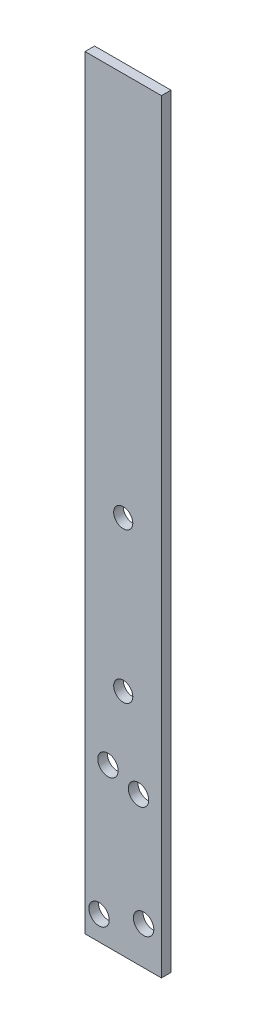
ISO-10303-21;
HEADER;
FILE_DESCRIPTION(('STEP AP214'),'2;1');
FILE_NAME('part.step','',(''),(''),'','','');
FILE_SCHEMA(('AUTOMOTIVE_DESIGN { 1 0 10303 214 1 1 1 1 }'));
ENDSEC;
DATA;
#1=APPLICATION_CONTEXT('core data for automotive mechanical design processes');
#2=APPLICATION_PROTOCOL_DEFINITION('international standard','automotive_design',2000,#1);
#3=PRODUCT_CONTEXT('',#1,'mechanical');
#4=PRODUCT('Part','Part','',(#3));
#5=PRODUCT_RELATED_PRODUCT_CATEGORY('part','',(#4));
#6=PRODUCT_DEFINITION_FORMATION('','',#4);
#7=PRODUCT_DEFINITION_CONTEXT('part definition',#1,'design');
#8=PRODUCT_DEFINITION('design','',#6,#7);
#9=PRODUCT_DEFINITION_SHAPE('','',#8);
#10=(LENGTH_UNIT() NAMED_UNIT(*) SI_UNIT(.MILLI.,.METRE.));
#11=(NAMED_UNIT(*) PLANE_ANGLE_UNIT() SI_UNIT($,.RADIAN.));
#12=(NAMED_UNIT(*) SI_UNIT($,.STERADIAN.) SOLID_ANGLE_UNIT());
#13=UNCERTAINTY_MEASURE_WITH_UNIT(LENGTH_MEASURE(1.E-05),#10,'distance_accuracy_value','');
#14=(GEOMETRIC_REPRESENTATION_CONTEXT(3) GLOBAL_UNCERTAINTY_ASSIGNED_CONTEXT((#13)) GLOBAL_UNIT_ASSIGNED_CONTEXT((#10,
#11,#12)) REPRESENTATION_CONTEXT('',''));
#15=CARTESIAN_POINT('',(0.,0.,0.));
#16=DIRECTION('',(0.,0.,1.));
#17=DIRECTION('',(1.,0.,0.));
#18=AXIS2_PLACEMENT_3D('',#15,#16,#17);
#19=CARTESIAN_POINT('',(0.,0.,4.7625));
#20=DIRECTION('',(0.,0.,1.));
#21=DIRECTION('',(1.,0.,0.));
#22=AXIS2_PLACEMENT_3D('',#19,#20,#21);
#23=PLANE('',#22);
#24=CARTESIAN_POINT('',(6.98500000000002,12.01546619,4.7625));
#25=DIRECTION('',(0.,0.,1.));
#26=DIRECTION('',(1.,0.,0.));
#27=AXIS2_PLACEMENT_3D('',#24,#25,#26);
#28=CIRCLE('',#27,5.08000000000001);
#29=CARTESIAN_POINT('',(1.90500000000002,12.01546619,4.7625));
#30=VERTEX_POINT('',#29);
#31=EDGE_CURVE('E162',#30,#30,#28,.T.);
#32=ORIENTED_EDGE('',*,*,#31,.F.);
#33=EDGE_LOOP('',(#32));
#34=FACE_BOUND('',#33,.T.);
#35=CARTESIAN_POINT('',(11.43,78.69046619,4.7625));
#36=DIRECTION('',(0.,0.,1.));
#37=DIRECTION('',(1.,0.,0.));
#38=AXIS2_PLACEMENT_3D('',#35,#36,#37);
#39=CIRCLE('',#38,5.08);
#40=CARTESIAN_POINT('',(6.35000000000001,78.69046619,4.7625));
#41=VERTEX_POINT('',#40);
#42=EDGE_CURVE('E146',#41,#41,#39,.T.);
#43=ORIENTED_EDGE('',*,*,#42,.F.);
#44=EDGE_LOOP('',(#43));
#45=FACE_BOUND('',#44,.T.);
#46=CARTESIAN_POINT('',(19.05,114.3,4.7625));
#47=DIRECTION('',(0.,0.,1.));
#48=DIRECTION('',(1.,0.,0.));
#49=AXIS2_PLACEMENT_3D('',#46,#47,#48);
#50=CIRCLE('',#49,4.7625);
#51=CARTESIAN_POINT('',(14.2875,114.3,4.7625));
#52=VERTEX_POINT('',#51);
#53=EDGE_CURVE('E116',#52,#52,#50,.T.);
#54=ORIENTED_EDGE('',*,*,#53,.F.);
#55=EDGE_LOOP('',(#54));
#56=FACE_BOUND('',#55,.T.);
#57=DIRECTION('',(1.,0.,0.));
#58=VECTOR('',#57,1.);
#59=CARTESIAN_POINT('',(0.,0.,4.7625));
#60=LINE('',#59,#58);
#61=CARTESIAN_POINT('',(0.,0.,4.7625));
#62=VERTEX_POINT('',#61);
#63=CARTESIAN_POINT('',(38.1,0.,4.7625));
#64=VERTEX_POINT('',#63);
#65=EDGE_CURVE('E96',#62,#64,#60,.T.);
#66=ORIENTED_EDGE('',*,*,#65,.T.);
#67=DIRECTION('',(0.,1.,0.));
#68=VECTOR('',#67,1.);
#69=CARTESIAN_POINT('',(38.1,0.,4.7625));
#70=LINE('',#69,#68);
#71=CARTESIAN_POINT('',(38.0999999999999,381.,4.7625));
#72=VERTEX_POINT('',#71);
#73=EDGE_CURVE('E91',#64,#72,#70,.T.);
#74=ORIENTED_EDGE('',*,*,#73,.T.);
#75=DIRECTION('',(-1.,0.,0.));
#76=VECTOR('',#75,1.);
#77=CARTESIAN_POINT('',(38.0999999999999,381.,4.7625));
#78=LINE('',#77,#76);
#79=CARTESIAN_POINT('',(0.,381.,4.7625));
#80=VERTEX_POINT('',#79);
#81=EDGE_CURVE('E94',#72,#80,#78,.T.);
#82=ORIENTED_EDGE('',*,*,#81,.T.);
#83=DIRECTION('',(0.,-1.,0.));
#84=VECTOR('',#83,1.);
#85=CARTESIAN_POINT('',(0.,0.,4.7625));
#86=LINE('',#85,#84);
#87=EDGE_CURVE('E61',#80,#62,#86,.T.);
#88=ORIENTED_EDGE('',*,*,#87,.T.);
#89=EDGE_LOOP('',(#66,#74,#82,#88));
#90=FACE_BOUND('',#89,.T.);
#91=CARTESIAN_POINT('',(19.05,189.23,4.7625));
#92=DIRECTION('',(0.,0.,1.));
#93=DIRECTION('',(1.,0.,0.));
#94=AXIS2_PLACEMENT_3D('',#91,#92,#93);
#95=CIRCLE('',#94,4.7625);
#96=CARTESIAN_POINT('',(14.2875,189.23,4.7625));
#97=VERTEX_POINT('',#96);
#98=EDGE_CURVE('E138',#97,#97,#95,.T.);
#99=ORIENTED_EDGE('',*,*,#98,.F.);
#100=EDGE_LOOP('',(#99));
#101=FACE_BOUND('',#100,.T.);
#102=CARTESIAN_POINT('',(26.67,73.61046619,4.7625));
#103=DIRECTION('',(0.,0.,1.));
#104=DIRECTION('',(1.,0.,0.));
#105=AXIS2_PLACEMENT_3D('',#102,#103,#104);
#106=CIRCLE('',#105,5.08000000000001);
#107=CARTESIAN_POINT('',(21.59,73.61046619,4.7625));
#108=VERTEX_POINT('',#107);
#109=EDGE_CURVE('E154',#108,#108,#106,.T.);
#110=ORIENTED_EDGE('',*,*,#109,.F.);
#111=EDGE_LOOP('',(#110));
#112=FACE_BOUND('',#111,.T.);
#113=CARTESIAN_POINT('',(29.21,19.00046619,4.7625));
#114=DIRECTION('',(0.,0.,1.));
#115=DIRECTION('',(1.,0.,0.));
#116=AXIS2_PLACEMENT_3D('',#113,#114,#115);
#117=CIRCLE('',#116,5.08);
#118=CARTESIAN_POINT('',(24.13,19.00046619,4.7625));
#119=VERTEX_POINT('',#118);
#120=EDGE_CURVE('E170',#119,#119,#117,.T.);
#121=ORIENTED_EDGE('',*,*,#120,.F.);
#122=EDGE_LOOP('',(#121));
#123=FACE_BOUND('',#122,.T.);
#124=ADVANCED_FACE('F43',(#34,#45,#56,#90,#101,#112,#123),#23,.T.);
#125=CARTESIAN_POINT('',(0.,0.,0.));
#126=DIRECTION('',(0.,0.,1.));
#127=DIRECTION('',(1.,0.,0.));
#128=AXIS2_PLACEMENT_3D('',#125,#126,#127);
#129=PLANE('',#128);
#130=DIRECTION('',(1.,0.,0.));
#131=VECTOR('',#130,1.);
#132=CARTESIAN_POINT('',(0.,0.,0.));
#133=LINE('',#132,#131);
#134=CARTESIAN_POINT('',(0.,0.,0.));
#135=VERTEX_POINT('',#134);
#136=CARTESIAN_POINT('',(38.1,0.,0.));
#137=VERTEX_POINT('',#136);
#138=EDGE_CURVE('E112',#135,#137,#133,.T.);
#139=ORIENTED_EDGE('',*,*,#138,.F.);
#140=DIRECTION('',(0.,-1.,0.));
#141=VECTOR('',#140,1.);
#142=CARTESIAN_POINT('',(0.,0.,0.));
#143=LINE('',#142,#141);
#144=CARTESIAN_POINT('',(0.,381.,0.));
#145=VERTEX_POINT('',#144);
#146=EDGE_CURVE('E84',#145,#135,#143,.T.);
#147=ORIENTED_EDGE('',*,*,#146,.F.);
#148=DIRECTION('',(-1.,0.,0.));
#149=VECTOR('',#148,1.);
#150=CARTESIAN_POINT('',(38.0999999999999,381.,0.));
#151=LINE('',#150,#149);
#152=CARTESIAN_POINT('',(38.0999999999999,381.,0.));
#153=VERTEX_POINT('',#152);
#154=EDGE_CURVE('E78',#153,#145,#151,.T.);
#155=ORIENTED_EDGE('',*,*,#154,.F.);
#156=DIRECTION('',(0.,1.,0.));
#157=VECTOR('',#156,1.);
#158=CARTESIAN_POINT('',(38.1,0.,0.));
#159=LINE('',#158,#157);
#160=EDGE_CURVE('E101',#137,#153,#159,.T.);
#161=ORIENTED_EDGE('',*,*,#160,.F.);
#162=EDGE_LOOP('',(#139,#147,#155,#161));
#163=FACE_BOUND('',#162,.T.);
#164=CARTESIAN_POINT('',(19.05,114.3,0.));
#165=DIRECTION('',(0.,0.,1.));
#166=DIRECTION('',(1.,0.,0.));
#167=AXIS2_PLACEMENT_3D('',#164,#165,#166);
#168=CIRCLE('',#167,4.7625);
#169=CARTESIAN_POINT('',(14.2875,114.3,0.));
#170=VERTEX_POINT('',#169);
#171=EDGE_CURVE('E134',#170,#170,#168,.T.);
#172=ORIENTED_EDGE('',*,*,#171,.T.);
#173=EDGE_LOOP('',(#172));
#174=FACE_BOUND('',#173,.T.);
#175=CARTESIAN_POINT('',(19.05,189.23,0.));
#176=DIRECTION('',(0.,0.,1.));
#177=DIRECTION('',(1.,0.,0.));
#178=AXIS2_PLACEMENT_3D('',#175,#176,#177);
#179=CIRCLE('',#178,4.7625);
#180=CARTESIAN_POINT('',(14.2875,189.23,0.));
#181=VERTEX_POINT('',#180);
#182=EDGE_CURVE('E142',#181,#181,#179,.T.);
#183=ORIENTED_EDGE('',*,*,#182,.T.);
#184=EDGE_LOOP('',(#183));
#185=FACE_BOUND('',#184,.T.);
#186=CARTESIAN_POINT('',(11.43,78.69046619,0.));
#187=DIRECTION('',(0.,0.,1.));
#188=DIRECTION('',(1.,0.,0.));
#189=AXIS2_PLACEMENT_3D('',#186,#187,#188);
#190=CIRCLE('',#189,5.08);
#191=CARTESIAN_POINT('',(6.35000000000001,78.69046619,0.));
#192=VERTEX_POINT('',#191);
#193=EDGE_CURVE('E150',#192,#192,#190,.T.);
#194=ORIENTED_EDGE('',*,*,#193,.T.);
#195=EDGE_LOOP('',(#194));
#196=FACE_BOUND('',#195,.T.);
#197=CARTESIAN_POINT('',(26.67,73.61046619,0.));
#198=DIRECTION('',(0.,0.,1.));
#199=DIRECTION('',(1.,0.,0.));
#200=AXIS2_PLACEMENT_3D('',#197,#198,#199);
#201=CIRCLE('',#200,5.08000000000001);
#202=CARTESIAN_POINT('',(21.59,73.61046619,0.));
#203=VERTEX_POINT('',#202);
#204=EDGE_CURVE('E158',#203,#203,#201,.T.);
#205=ORIENTED_EDGE('',*,*,#204,.T.);
#206=EDGE_LOOP('',(#205));
#207=FACE_BOUND('',#206,.T.);
#208=CARTESIAN_POINT('',(6.98500000000002,12.01546619,0.));
#209=DIRECTION('',(0.,0.,1.));
#210=DIRECTION('',(1.,0.,0.));
#211=AXIS2_PLACEMENT_3D('',#208,#209,#210);
#212=CIRCLE('',#211,5.08000000000001);
#213=CARTESIAN_POINT('',(1.90500000000002,12.01546619,0.));
#214=VERTEX_POINT('',#213);
#215=EDGE_CURVE('E166',#214,#214,#212,.T.);
#216=ORIENTED_EDGE('',*,*,#215,.T.);
#217=EDGE_LOOP('',(#216));
#218=FACE_BOUND('',#217,.T.);
#219=CARTESIAN_POINT('',(29.21,19.00046619,0.));
#220=DIRECTION('',(0.,0.,1.));
#221=DIRECTION('',(1.,0.,0.));
#222=AXIS2_PLACEMENT_3D('',#219,#220,#221);
#223=CIRCLE('',#222,5.08);
#224=CARTESIAN_POINT('',(24.13,19.00046619,0.));
#225=VERTEX_POINT('',#224);
#226=EDGE_CURVE('E174',#225,#225,#223,.T.);
#227=ORIENTED_EDGE('',*,*,#226,.T.);
#228=EDGE_LOOP('',(#227));
#229=FACE_BOUND('',#228,.T.);
#230=ADVANCED_FACE('F129',(#163,#174,#185,#196,#207,#218,#229),#129,.F.);
#231=CARTESIAN_POINT('',(0.,0.,4.7625));
#232=DIRECTION('',(0.,1.,0.));
#233=DIRECTION('',(0.,0.,1.));
#234=AXIS2_PLACEMENT_3D('',#231,#232,#233);
#235=PLANE('',#234);
#236=ORIENTED_EDGE('',*,*,#138,.T.);
#237=DIRECTION('',(0.,0.,-1.));
#238=VECTOR('',#237,1.);
#239=CARTESIAN_POINT('',(38.1,0.,4.7625));
#240=LINE('',#239,#238);
#241=EDGE_CURVE('E11',#64,#137,#240,.T.);
#242=ORIENTED_EDGE('',*,*,#241,.F.);
#243=ORIENTED_EDGE('',*,*,#65,.F.);
#244=DIRECTION('',(0.,0.,-1.));
#245=VECTOR('',#244,1.);
#246=CARTESIAN_POINT('',(0.,0.,4.7625));
#247=LINE('',#246,#245);
#248=EDGE_CURVE('E108',#62,#135,#247,.T.);
#249=ORIENTED_EDGE('',*,*,#248,.T.);
#250=EDGE_LOOP('',(#236,#242,#243,#249));
#251=FACE_BOUND('',#250,.T.);
#252=ADVANCED_FACE('F45',(#251),#235,.F.);
#253=CARTESIAN_POINT('',(38.1,0.,4.7625));
#254=DIRECTION('',(-1.,0.,0.));
#255=DIRECTION('',(0.,-1.,0.));
#256=AXIS2_PLACEMENT_3D('',#253,#254,#255);
#257=PLANE('',#256);
#258=ORIENTED_EDGE('',*,*,#160,.T.);
#259=DIRECTION('',(0.,0.,-1.));
#260=VECTOR('',#259,1.);
#261=CARTESIAN_POINT('',(38.0999999999999,381.,4.7625));
#262=LINE('',#261,#260);
#263=EDGE_CURVE('E53',#72,#153,#262,.T.);
#264=ORIENTED_EDGE('',*,*,#263,.F.);
#265=ORIENTED_EDGE('',*,*,#73,.F.);
#266=ORIENTED_EDGE('',*,*,#241,.T.);
#267=EDGE_LOOP('',(#258,#264,#265,#266));
#268=FACE_BOUND('',#267,.T.);
#269=ADVANCED_FACE('F100',(#268),#257,.F.);
#270=CARTESIAN_POINT('',(38.0999999999999,381.,4.7625));
#271=DIRECTION('',(0.,-1.,0.));
#272=DIRECTION('',(0.,0.,-1.));
#273=AXIS2_PLACEMENT_3D('',#270,#271,#272);
#274=PLANE('',#273);
#275=ORIENTED_EDGE('',*,*,#154,.T.);
#276=DIRECTION('',(0.,0.,-1.));
#277=VECTOR('',#276,1.);
#278=CARTESIAN_POINT('',(0.,381.,4.7625));
#279=LINE('',#278,#277);
#280=EDGE_CURVE('E103',#80,#145,#279,.T.);
#281=ORIENTED_EDGE('',*,*,#280,.F.);
#282=ORIENTED_EDGE('',*,*,#81,.F.);
#283=ORIENTED_EDGE('',*,*,#263,.T.);
#284=EDGE_LOOP('',(#275,#281,#282,#283));
#285=FACE_BOUND('',#284,.T.);
#286=ADVANCED_FACE('F104',(#285),#274,.F.);
#287=CARTESIAN_POINT('',(0.,0.,4.7625));
#288=DIRECTION('',(1.,0.,0.));
#289=DIRECTION('',(0.,1.,0.));
#290=AXIS2_PLACEMENT_3D('',#287,#288,#289);
#291=PLANE('',#290);
#292=ORIENTED_EDGE('',*,*,#146,.T.);
#293=ORIENTED_EDGE('',*,*,#248,.F.);
#294=ORIENTED_EDGE('',*,*,#87,.F.);
#295=ORIENTED_EDGE('',*,*,#280,.T.);
#296=EDGE_LOOP('',(#292,#293,#294,#295));
#297=FACE_BOUND('',#296,.T.);
#298=ADVANCED_FACE('F126',(#297),#291,.F.);
#299=CARTESIAN_POINT('',(19.05,114.3,4.7625));
#300=DIRECTION('',(0.,0.,-1.));
#301=DIRECTION('',(-1.,0.,0.));
#302=AXIS2_PLACEMENT_3D('',#299,#300,#301);
#303=CYLINDRICAL_SURFACE('',#302,4.7625);
#304=CARTESIAN_POINT('',(14.2875,114.3,4.7625));
#305=CARTESIAN_POINT('',(14.2875,114.3,4.712890625));
#306=CARTESIAN_POINT('',(14.2875,114.3,4.66328125));
#307=CARTESIAN_POINT('',(14.2875,114.3,4.5640625));
#308=CARTESIAN_POINT('',(14.2875,114.3,4.514453125));
#309=CARTESIAN_POINT('',(14.2875,114.3,4.415234375));
#310=CARTESIAN_POINT('',(14.2875,114.3,4.365625));
#311=CARTESIAN_POINT('',(14.2875,114.3,4.26640625));
#312=CARTESIAN_POINT('',(14.2875,114.3,4.216796875));
#313=CARTESIAN_POINT('',(14.2875,114.3,4.117578125));
#314=CARTESIAN_POINT('',(14.2875,114.3,4.06796875));
#315=CARTESIAN_POINT('',(14.2875,114.3,3.96875));
#316=CARTESIAN_POINT('',(14.2875,114.3,3.919140625));
#317=CARTESIAN_POINT('',(14.2875,114.3,3.819921875));
#318=CARTESIAN_POINT('',(14.2875,114.3,3.7703125));
#319=CARTESIAN_POINT('',(14.2875,114.3,3.67109375));
#320=CARTESIAN_POINT('',(14.2875,114.3,3.621484375));
#321=CARTESIAN_POINT('',(14.2875,114.3,3.522265625));
#322=CARTESIAN_POINT('',(14.2875,114.3,3.47265625));
#323=CARTESIAN_POINT('',(14.2875,114.3,3.3734375));
#324=CARTESIAN_POINT('',(14.2875,114.3,3.323828125));
#325=CARTESIAN_POINT('',(14.2875,114.3,3.224609375));
#326=CARTESIAN_POINT('',(14.2875,114.3,3.175));
#327=CARTESIAN_POINT('',(14.2875,114.3,3.07578125));
#328=CARTESIAN_POINT('',(14.2875,114.3,3.026171875));
#329=CARTESIAN_POINT('',(14.2875,114.3,2.926953125));
#330=CARTESIAN_POINT('',(14.2875,114.3,2.87734375));
#331=CARTESIAN_POINT('',(14.2875,114.3,2.778125));
#332=CARTESIAN_POINT('',(14.2875,114.3,2.728515625));
#333=CARTESIAN_POINT('',(14.2875,114.3,2.629296875));
#334=CARTESIAN_POINT('',(14.2875,114.3,2.5796875));
#335=CARTESIAN_POINT('',(14.2875,114.3,2.48046875));
#336=CARTESIAN_POINT('',(14.2875,114.3,2.430859375));
#337=CARTESIAN_POINT('',(14.2875,114.3,2.331640625));
#338=CARTESIAN_POINT('',(14.2875,114.3,2.28203125));
#339=CARTESIAN_POINT('',(14.2875,114.3,2.1828125));
#340=CARTESIAN_POINT('',(14.2875,114.3,2.133203125));
#341=CARTESIAN_POINT('',(14.2875,114.3,2.033984375));
#342=CARTESIAN_POINT('',(14.2875,114.3,1.984375));
#343=CARTESIAN_POINT('',(14.2875,114.3,1.88515625));
#344=CARTESIAN_POINT('',(14.2875,114.3,1.835546875));
#345=CARTESIAN_POINT('',(14.2875,114.3,1.736328125));
#346=CARTESIAN_POINT('',(14.2875,114.3,1.68671875));
#347=CARTESIAN_POINT('',(14.2875,114.3,1.5875));
#348=CARTESIAN_POINT('',(14.2875,114.3,1.537890625));
#349=CARTESIAN_POINT('',(14.2875,114.3,1.438671875));
#350=CARTESIAN_POINT('',(14.2875,114.3,1.3890625));
#351=CARTESIAN_POINT('',(14.2875,114.3,1.28984375));
#352=CARTESIAN_POINT('',(14.2875,114.3,1.240234375));
#353=CARTESIAN_POINT('',(14.2875,114.3,1.141015625));
#354=CARTESIAN_POINT('',(14.2875,114.3,1.09140625));
#355=CARTESIAN_POINT('',(14.2875,114.3,0.992187499999999));
#356=CARTESIAN_POINT('',(14.2875,114.3,0.942578124999999));
#357=CARTESIAN_POINT('',(14.2875,114.3,0.843359375));
#358=CARTESIAN_POINT('',(14.2875,114.3,0.79375));
#359=CARTESIAN_POINT('',(14.2875,114.3,0.69453125));
#360=CARTESIAN_POINT('',(14.2875,114.3,0.644921875));
#361=CARTESIAN_POINT('',(14.2875,114.3,0.545703125));
#362=CARTESIAN_POINT('',(14.2875,114.3,0.49609375));
#363=CARTESIAN_POINT('',(14.2875,114.3,0.396875));
#364=CARTESIAN_POINT('',(14.2875,114.3,0.347265625));
#365=CARTESIAN_POINT('',(14.2875,114.3,0.248046875));
#366=CARTESIAN_POINT('',(14.2875,114.3,0.1984375));
#367=CARTESIAN_POINT('',(14.2875,114.3,0.09921875));
#368=CARTESIAN_POINT('',(14.2875,114.3,0.049609375));
#369=CARTESIAN_POINT('',(14.2875,114.3,0.));
#370=B_SPLINE_CURVE_WITH_KNOTS('',3,(#304,#305,#306,#307,#308,#309,#310,#311,#312,#313,#314,
#315,#316,#317,#318,#319,#320,#321,#322,#323,#324,#325,#326,#327,#328,#329,#330,#331,#332,#333,
#334,#335,#336,#337,#338,#339,#340,#341,#342,#343,#344,#345,#346,#347,#348,#349,#350,#351,#352,
#353,#354,#355,#356,#357,#358,#359,#360,#361,#362,#363,#364,#365,#366,#367,#368,#369),
.UNSPECIFIED.,.F.,.F.,(4,2,2,2,2,2,2,2,2,2,2,2,2,2,2,2,2,2,2,2,2,2,2,2,2,2,2,2,2,2,2,2,4),(0.,
0.148828125,0.29765625,0.446484375,0.5953125,0.744140625,0.892968750000001,1.041796875,1.190625,
1.339453125,1.48828125,1.637109375,1.7859375,1.934765625,2.08359375,2.232421875,2.38125,
2.530078125,2.67890625,2.827734375,2.9765625,3.125390625,3.27421875,3.423046875,3.571875,
3.720703125,3.86953125,4.018359375,4.1671875,4.316015625,4.46484375,4.613671875,4.7625),.UNSPECIFIED.);
#371=EDGE_CURVE('BSEAM195',#52,#170,#370,.T.);
#372=ORIENTED_EDGE('',*,*,#53,.T.);
#373=ORIENTED_EDGE('',*,*,#171,.F.);
#374=ORIENTED_EDGE('',*,*,#371,.T.);
#375=ORIENTED_EDGE('',*,*,#371,.F.);
#376=EDGE_LOOP('',(#372,#374,#373,#375));
#377=FACE_BOUND('',#376,.T.);
#378=ADVANCED_FACE('F195',(#377),#303,.F.);
#379=CARTESIAN_POINT('',(19.05,189.23,4.7625));
#380=DIRECTION('',(0.,0.,-1.));
#381=DIRECTION('',(-1.,0.,0.));
#382=AXIS2_PLACEMENT_3D('',#379,#380,#381);
#383=CYLINDRICAL_SURFACE('',#382,4.7625);
#384=CARTESIAN_POINT('',(14.2875,189.23,4.7625));
#385=CARTESIAN_POINT('',(14.2875,189.23,4.712890625));
#386=CARTESIAN_POINT('',(14.2875,189.23,4.66328125));
#387=CARTESIAN_POINT('',(14.2875,189.23,4.5640625));
#388=CARTESIAN_POINT('',(14.2875,189.23,4.514453125));
#389=CARTESIAN_POINT('',(14.2875,189.23,4.415234375));
#390=CARTESIAN_POINT('',(14.2875,189.23,4.365625));
#391=CARTESIAN_POINT('',(14.2875,189.23,4.26640625));
#392=CARTESIAN_POINT('',(14.2875,189.23,4.216796875));
#393=CARTESIAN_POINT('',(14.2875,189.23,4.117578125));
#394=CARTESIAN_POINT('',(14.2875,189.23,4.06796875));
#395=CARTESIAN_POINT('',(14.2875,189.23,3.96875));
#396=CARTESIAN_POINT('',(14.2875,189.23,3.919140625));
#397=CARTESIAN_POINT('',(14.2875,189.23,3.819921875));
#398=CARTESIAN_POINT('',(14.2875,189.23,3.7703125));
#399=CARTESIAN_POINT('',(14.2875,189.23,3.67109375));
#400=CARTESIAN_POINT('',(14.2875,189.23,3.621484375));
#401=CARTESIAN_POINT('',(14.2875,189.23,3.522265625));
#402=CARTESIAN_POINT('',(14.2875,189.23,3.47265625));
#403=CARTESIAN_POINT('',(14.2875,189.23,3.3734375));
#404=CARTESIAN_POINT('',(14.2875,189.23,3.323828125));
#405=CARTESIAN_POINT('',(14.2875,189.23,3.224609375));
#406=CARTESIAN_POINT('',(14.2875,189.23,3.175));
#407=CARTESIAN_POINT('',(14.2875,189.23,3.07578125));
#408=CARTESIAN_POINT('',(14.2875,189.23,3.026171875));
#409=CARTESIAN_POINT('',(14.2875,189.23,2.926953125));
#410=CARTESIAN_POINT('',(14.2875,189.23,2.87734375));
#411=CARTESIAN_POINT('',(14.2875,189.23,2.778125));
#412=CARTESIAN_POINT('',(14.2875,189.23,2.728515625));
#413=CARTESIAN_POINT('',(14.2875,189.23,2.629296875));
#414=CARTESIAN_POINT('',(14.2875,189.23,2.5796875));
#415=CARTESIAN_POINT('',(14.2875,189.23,2.48046875));
#416=CARTESIAN_POINT('',(14.2875,189.23,2.430859375));
#417=CARTESIAN_POINT('',(14.2875,189.23,2.331640625));
#418=CARTESIAN_POINT('',(14.2875,189.23,2.28203125));
#419=CARTESIAN_POINT('',(14.2875,189.23,2.1828125));
#420=CARTESIAN_POINT('',(14.2875,189.23,2.133203125));
#421=CARTESIAN_POINT('',(14.2875,189.23,2.033984375));
#422=CARTESIAN_POINT('',(14.2875,189.23,1.984375));
#423=CARTESIAN_POINT('',(14.2875,189.23,1.88515625));
#424=CARTESIAN_POINT('',(14.2875,189.23,1.835546875));
#425=CARTESIAN_POINT('',(14.2875,189.23,1.736328125));
#426=CARTESIAN_POINT('',(14.2875,189.23,1.68671875));
#427=CARTESIAN_POINT('',(14.2875,189.23,1.5875));
#428=CARTESIAN_POINT('',(14.2875,189.23,1.537890625));
#429=CARTESIAN_POINT('',(14.2875,189.23,1.438671875));
#430=CARTESIAN_POINT('',(14.2875,189.23,1.3890625));
#431=CARTESIAN_POINT('',(14.2875,189.23,1.28984375));
#432=CARTESIAN_POINT('',(14.2875,189.23,1.240234375));
#433=CARTESIAN_POINT('',(14.2875,189.23,1.141015625));
#434=CARTESIAN_POINT('',(14.2875,189.23,1.09140625));
#435=CARTESIAN_POINT('',(14.2875,189.23,0.992187499999999));
#436=CARTESIAN_POINT('',(14.2875,189.23,0.942578124999999));
#437=CARTESIAN_POINT('',(14.2875,189.23,0.843359375));
#438=CARTESIAN_POINT('',(14.2875,189.23,0.79375));
#439=CARTESIAN_POINT('',(14.2875,189.23,0.69453125));
#440=CARTESIAN_POINT('',(14.2875,189.23,0.644921875));
#441=CARTESIAN_POINT('',(14.2875,189.23,0.545703125));
#442=CARTESIAN_POINT('',(14.2875,189.23,0.49609375));
#443=CARTESIAN_POINT('',(14.2875,189.23,0.396875));
#444=CARTESIAN_POINT('',(14.2875,189.23,0.347265625));
#445=CARTESIAN_POINT('',(14.2875,189.23,0.248046875));
#446=CARTESIAN_POINT('',(14.2875,189.23,0.1984375));
#447=CARTESIAN_POINT('',(14.2875,189.23,0.09921875));
#448=CARTESIAN_POINT('',(14.2875,189.23,0.049609375));
#449=CARTESIAN_POINT('',(14.2875,189.23,0.));
#450=B_SPLINE_CURVE_WITH_KNOTS('',3,(#384,#385,#386,#387,#388,#389,#390,#391,#392,#393,#394,
#395,#396,#397,#398,#399,#400,#401,#402,#403,#404,#405,#406,#407,#408,#409,#410,#411,#412,#413,
#414,#415,#416,#417,#418,#419,#420,#421,#422,#423,#424,#425,#426,#427,#428,#429,#430,#431,#432,
#433,#434,#435,#436,#437,#438,#439,#440,#441,#442,#443,#444,#445,#446,#447,#448,#449),
.UNSPECIFIED.,.F.,.F.,(4,2,2,2,2,2,2,2,2,2,2,2,2,2,2,2,2,2,2,2,2,2,2,2,2,2,2,2,2,2,2,2,4),(0.,
0.148828125,0.29765625,0.446484375,0.5953125,0.744140625,0.892968750000001,1.041796875,1.190625,
1.339453125,1.48828125,1.637109375,1.7859375,1.934765625,2.08359375,2.232421875,2.38125,
2.530078125,2.67890625,2.827734375,2.9765625,3.125390625,3.27421875,3.423046875,3.571875,
3.720703125,3.86953125,4.018359375,4.1671875,4.316015625,4.46484375,4.613671875,4.7625),.UNSPECIFIED.);
#451=EDGE_CURVE('BSEAM249',#97,#181,#450,.T.);
#452=ORIENTED_EDGE('',*,*,#98,.T.);
#453=ORIENTED_EDGE('',*,*,#182,.F.);
#454=ORIENTED_EDGE('',*,*,#451,.T.);
#455=ORIENTED_EDGE('',*,*,#451,.F.);
#456=EDGE_LOOP('',(#452,#454,#453,#455));
#457=FACE_BOUND('',#456,.T.);
#458=ADVANCED_FACE('F249',(#457),#383,.F.);
#459=CARTESIAN_POINT('',(11.43,78.69046619,4.7625));
#460=DIRECTION('',(0.,0.,-1.));
#461=DIRECTION('',(-1.,0.,0.));
#462=AXIS2_PLACEMENT_3D('',#459,#460,#461);
#463=CYLINDRICAL_SURFACE('',#462,5.08);
#464=CARTESIAN_POINT('',(6.35000000000001,78.69046619,4.7625));
#465=CARTESIAN_POINT('',(6.35000000000001,78.69046619,4.712890625));
#466=CARTESIAN_POINT('',(6.35000000000001,78.69046619,4.66328125));
#467=CARTESIAN_POINT('',(6.35000000000001,78.69046619,4.5640625));
#468=CARTESIAN_POINT('',(6.35000000000001,78.69046619,4.514453125));
#469=CARTESIAN_POINT('',(6.35000000000001,78.69046619,4.415234375));
#470=CARTESIAN_POINT('',(6.35000000000001,78.69046619,4.365625));
#471=CARTESIAN_POINT('',(6.35000000000001,78.69046619,4.26640625));
#472=CARTESIAN_POINT('',(6.35000000000001,78.69046619,4.216796875));
#473=CARTESIAN_POINT('',(6.35000000000001,78.69046619,4.117578125));
#474=CARTESIAN_POINT('',(6.35000000000001,78.69046619,4.06796875));
#475=CARTESIAN_POINT('',(6.35000000000001,78.69046619,3.96875));
#476=CARTESIAN_POINT('',(6.35000000000001,78.69046619,3.919140625));
#477=CARTESIAN_POINT('',(6.35000000000001,78.69046619,3.819921875));
#478=CARTESIAN_POINT('',(6.35000000000001,78.69046619,3.7703125));
#479=CARTESIAN_POINT('',(6.35000000000001,78.69046619,3.67109375));
#480=CARTESIAN_POINT('',(6.35000000000001,78.69046619,3.621484375));
#481=CARTESIAN_POINT('',(6.35000000000001,78.69046619,3.522265625));
#482=CARTESIAN_POINT('',(6.35000000000001,78.69046619,3.47265625));
#483=CARTESIAN_POINT('',(6.35000000000001,78.69046619,3.3734375));
#484=CARTESIAN_POINT('',(6.35000000000001,78.69046619,3.323828125));
#485=CARTESIAN_POINT('',(6.35000000000001,78.69046619,3.224609375));
#486=CARTESIAN_POINT('',(6.35000000000001,78.69046619,3.175));
#487=CARTESIAN_POINT('',(6.35000000000001,78.69046619,3.07578125));
#488=CARTESIAN_POINT('',(6.35000000000001,78.69046619,3.026171875));
#489=CARTESIAN_POINT('',(6.35000000000001,78.69046619,2.926953125));
#490=CARTESIAN_POINT('',(6.35000000000001,78.69046619,2.87734375));
#491=CARTESIAN_POINT('',(6.35000000000001,78.69046619,2.778125));
#492=CARTESIAN_POINT('',(6.35000000000001,78.69046619,2.728515625));
#493=CARTESIAN_POINT('',(6.35000000000001,78.69046619,2.629296875));
#494=CARTESIAN_POINT('',(6.35000000000001,78.69046619,2.5796875));
#495=CARTESIAN_POINT('',(6.35000000000001,78.69046619,2.48046875));
#496=CARTESIAN_POINT('',(6.35000000000001,78.69046619,2.430859375));
#497=CARTESIAN_POINT('',(6.35000000000001,78.69046619,2.331640625));
#498=CARTESIAN_POINT('',(6.35000000000001,78.69046619,2.28203125));
#499=CARTESIAN_POINT('',(6.35000000000001,78.69046619,2.1828125));
#500=CARTESIAN_POINT('',(6.35000000000001,78.69046619,2.133203125));
#501=CARTESIAN_POINT('',(6.35000000000001,78.69046619,2.033984375));
#502=CARTESIAN_POINT('',(6.35000000000001,78.69046619,1.984375));
#503=CARTESIAN_POINT('',(6.35000000000001,78.69046619,1.88515625));
#504=CARTESIAN_POINT('',(6.35000000000001,78.69046619,1.835546875));
#505=CARTESIAN_POINT('',(6.35000000000001,78.69046619,1.736328125));
#506=CARTESIAN_POINT('',(6.35000000000001,78.69046619,1.68671875));
#507=CARTESIAN_POINT('',(6.35000000000001,78.69046619,1.5875));
#508=CARTESIAN_POINT('',(6.35000000000001,78.69046619,1.537890625));
#509=CARTESIAN_POINT('',(6.35000000000001,78.69046619,1.438671875));
#510=CARTESIAN_POINT('',(6.35000000000001,78.69046619,1.3890625));
#511=CARTESIAN_POINT('',(6.35000000000001,78.69046619,1.28984375));
#512=CARTESIAN_POINT('',(6.35000000000001,78.69046619,1.240234375));
#513=CARTESIAN_POINT('',(6.35000000000001,78.69046619,1.141015625));
#514=CARTESIAN_POINT('',(6.35000000000001,78.69046619,1.09140625));
#515=CARTESIAN_POINT('',(6.35000000000001,78.69046619,0.992187499999999));
#516=CARTESIAN_POINT('',(6.35000000000001,78.69046619,0.942578124999999));
#517=CARTESIAN_POINT('',(6.35000000000001,78.69046619,0.843359375));
#518=CARTESIAN_POINT('',(6.35000000000001,78.69046619,0.79375));
#519=CARTESIAN_POINT('',(6.35000000000001,78.69046619,0.69453125));
#520=CARTESIAN_POINT('',(6.35000000000001,78.69046619,0.644921875));
#521=CARTESIAN_POINT('',(6.35000000000001,78.69046619,0.545703125));
#522=CARTESIAN_POINT('',(6.35000000000001,78.69046619,0.49609375));
#523=CARTESIAN_POINT('',(6.35000000000001,78.69046619,0.396875));
#524=CARTESIAN_POINT('',(6.35000000000001,78.69046619,0.347265625));
#525=CARTESIAN_POINT('',(6.35000000000001,78.69046619,0.248046875));
#526=CARTESIAN_POINT('',(6.35000000000001,78.69046619,0.1984375));
#527=CARTESIAN_POINT('',(6.35000000000001,78.69046619,0.09921875));
#528=CARTESIAN_POINT('',(6.35000000000001,78.69046619,0.049609375));
#529=CARTESIAN_POINT('',(6.35000000000001,78.69046619,0.));
#530=B_SPLINE_CURVE_WITH_KNOTS('',3,(#464,#465,#466,#467,#468,#469,#470,#471,#472,#473,#474,
#475,#476,#477,#478,#479,#480,#481,#482,#483,#484,#485,#486,#487,#488,#489,#490,#491,#492,#493,
#494,#495,#496,#497,#498,#499,#500,#501,#502,#503,#504,#505,#506,#507,#508,#509,#510,#511,#512,
#513,#514,#515,#516,#517,#518,#519,#520,#521,#522,#523,#524,#525,#526,#527,#528,#529),
.UNSPECIFIED.,.F.,.F.,(4,2,2,2,2,2,2,2,2,2,2,2,2,2,2,2,2,2,2,2,2,2,2,2,2,2,2,2,2,2,2,2,4),(0.,
0.148828125,0.29765625,0.446484375,0.5953125,0.744140625,0.892968750000001,1.041796875,1.190625,
1.339453125,1.48828125,1.637109375,1.7859375,1.934765625,2.08359375,2.232421875,2.38125,
2.530078125,2.67890625,2.827734375,2.9765625,3.125390625,3.27421875,3.423046875,3.571875,
3.720703125,3.86953125,4.018359375,4.1671875,4.316015625,4.46484375,4.613671875,4.7625),.UNSPECIFIED.);
#531=EDGE_CURVE('BSEAM258',#41,#192,#530,.T.);
#532=ORIENTED_EDGE('',*,*,#42,.T.);
#533=ORIENTED_EDGE('',*,*,#193,.F.);
#534=ORIENTED_EDGE('',*,*,#531,.T.);
#535=ORIENTED_EDGE('',*,*,#531,.F.);
#536=EDGE_LOOP('',(#532,#534,#533,#535));
#537=FACE_BOUND('',#536,.T.);
#538=ADVANCED_FACE('F258',(#537),#463,.F.);
#539=CARTESIAN_POINT('',(26.67,73.61046619,4.7625));
#540=DIRECTION('',(0.,0.,-1.));
#541=DIRECTION('',(-1.,0.,0.));
#542=AXIS2_PLACEMENT_3D('',#539,#540,#541);
#543=CYLINDRICAL_SURFACE('',#542,5.08000000000001);
#544=CARTESIAN_POINT('',(21.59,73.61046619,4.7625));
#545=CARTESIAN_POINT('',(21.59,73.61046619,4.712890625));
#546=CARTESIAN_POINT('',(21.59,73.61046619,4.66328125));
#547=CARTESIAN_POINT('',(21.59,73.61046619,4.5640625));
#548=CARTESIAN_POINT('',(21.59,73.61046619,4.514453125));
#549=CARTESIAN_POINT('',(21.59,73.61046619,4.415234375));
#550=CARTESIAN_POINT('',(21.59,73.61046619,4.365625));
#551=CARTESIAN_POINT('',(21.59,73.61046619,4.26640625));
#552=CARTESIAN_POINT('',(21.59,73.61046619,4.216796875));
#553=CARTESIAN_POINT('',(21.59,73.61046619,4.117578125));
#554=CARTESIAN_POINT('',(21.59,73.61046619,4.06796875));
#555=CARTESIAN_POINT('',(21.59,73.61046619,3.96875));
#556=CARTESIAN_POINT('',(21.59,73.61046619,3.919140625));
#557=CARTESIAN_POINT('',(21.59,73.61046619,3.819921875));
#558=CARTESIAN_POINT('',(21.59,73.61046619,3.7703125));
#559=CARTESIAN_POINT('',(21.59,73.61046619,3.67109375));
#560=CARTESIAN_POINT('',(21.59,73.61046619,3.621484375));
#561=CARTESIAN_POINT('',(21.59,73.61046619,3.522265625));
#562=CARTESIAN_POINT('',(21.59,73.61046619,3.47265625));
#563=CARTESIAN_POINT('',(21.59,73.61046619,3.3734375));
#564=CARTESIAN_POINT('',(21.59,73.61046619,3.323828125));
#565=CARTESIAN_POINT('',(21.59,73.61046619,3.224609375));
#566=CARTESIAN_POINT('',(21.59,73.61046619,3.175));
#567=CARTESIAN_POINT('',(21.59,73.61046619,3.07578125));
#568=CARTESIAN_POINT('',(21.59,73.61046619,3.026171875));
#569=CARTESIAN_POINT('',(21.59,73.61046619,2.926953125));
#570=CARTESIAN_POINT('',(21.59,73.61046619,2.87734375));
#571=CARTESIAN_POINT('',(21.59,73.61046619,2.778125));
#572=CARTESIAN_POINT('',(21.59,73.61046619,2.728515625));
#573=CARTESIAN_POINT('',(21.59,73.61046619,2.629296875));
#574=CARTESIAN_POINT('',(21.59,73.61046619,2.5796875));
#575=CARTESIAN_POINT('',(21.59,73.61046619,2.48046875));
#576=CARTESIAN_POINT('',(21.59,73.61046619,2.430859375));
#577=CARTESIAN_POINT('',(21.59,73.61046619,2.331640625));
#578=CARTESIAN_POINT('',(21.59,73.61046619,2.28203125));
#579=CARTESIAN_POINT('',(21.59,73.61046619,2.1828125));
#580=CARTESIAN_POINT('',(21.59,73.61046619,2.133203125));
#581=CARTESIAN_POINT('',(21.59,73.61046619,2.033984375));
#582=CARTESIAN_POINT('',(21.59,73.61046619,1.984375));
#583=CARTESIAN_POINT('',(21.59,73.61046619,1.88515625));
#584=CARTESIAN_POINT('',(21.59,73.61046619,1.835546875));
#585=CARTESIAN_POINT('',(21.59,73.61046619,1.736328125));
#586=CARTESIAN_POINT('',(21.59,73.61046619,1.68671875));
#587=CARTESIAN_POINT('',(21.59,73.61046619,1.5875));
#588=CARTESIAN_POINT('',(21.59,73.61046619,1.537890625));
#589=CARTESIAN_POINT('',(21.59,73.61046619,1.438671875));
#590=CARTESIAN_POINT('',(21.59,73.61046619,1.3890625));
#591=CARTESIAN_POINT('',(21.59,73.61046619,1.28984375));
#592=CARTESIAN_POINT('',(21.59,73.61046619,1.240234375));
#593=CARTESIAN_POINT('',(21.59,73.61046619,1.141015625));
#594=CARTESIAN_POINT('',(21.59,73.61046619,1.09140625));
#595=CARTESIAN_POINT('',(21.59,73.61046619,0.992187499999999));
#596=CARTESIAN_POINT('',(21.59,73.61046619,0.942578124999999));
#597=CARTESIAN_POINT('',(21.59,73.61046619,0.843359375));
#598=CARTESIAN_POINT('',(21.59,73.61046619,0.79375));
#599=CARTESIAN_POINT('',(21.59,73.61046619,0.69453125));
#600=CARTESIAN_POINT('',(21.59,73.61046619,0.644921875));
#601=CARTESIAN_POINT('',(21.59,73.61046619,0.545703125));
#602=CARTESIAN_POINT('',(21.59,73.61046619,0.49609375));
#603=CARTESIAN_POINT('',(21.59,73.61046619,0.396875));
#604=CARTESIAN_POINT('',(21.59,73.61046619,0.347265625));
#605=CARTESIAN_POINT('',(21.59,73.61046619,0.248046875));
#606=CARTESIAN_POINT('',(21.59,73.61046619,0.1984375));
#607=CARTESIAN_POINT('',(21.59,73.61046619,0.09921875));
#608=CARTESIAN_POINT('',(21.59,73.61046619,0.049609375));
#609=CARTESIAN_POINT('',(21.59,73.61046619,0.));
#610=B_SPLINE_CURVE_WITH_KNOTS('',3,(#544,#545,#546,#547,#548,#549,#550,#551,#552,#553,#554,
#555,#556,#557,#558,#559,#560,#561,#562,#563,#564,#565,#566,#567,#568,#569,#570,#571,#572,#573,
#574,#575,#576,#577,#578,#579,#580,#581,#582,#583,#584,#585,#586,#587,#588,#589,#590,#591,#592,
#593,#594,#595,#596,#597,#598,#599,#600,#601,#602,#603,#604,#605,#606,#607,#608,#609),
.UNSPECIFIED.,.F.,.F.,(4,2,2,2,2,2,2,2,2,2,2,2,2,2,2,2,2,2,2,2,2,2,2,2,2,2,2,2,2,2,2,2,4),(0.,
0.148828125,0.29765625,0.446484375,0.5953125,0.744140625,0.892968750000001,1.041796875,1.190625,
1.339453125,1.48828125,1.637109375,1.7859375,1.934765625,2.08359375,2.232421875,2.38125,
2.530078125,2.67890625,2.827734375,2.9765625,3.125390625,3.27421875,3.423046875,3.571875,
3.720703125,3.86953125,4.018359375,4.1671875,4.316015625,4.46484375,4.613671875,4.7625),.UNSPECIFIED.);
#611=EDGE_CURVE('BSEAM267',#108,#203,#610,.T.);
#612=ORIENTED_EDGE('',*,*,#109,.T.);
#613=ORIENTED_EDGE('',*,*,#204,.F.);
#614=ORIENTED_EDGE('',*,*,#611,.T.);
#615=ORIENTED_EDGE('',*,*,#611,.F.);
#616=EDGE_LOOP('',(#612,#614,#613,#615));
#617=FACE_BOUND('',#616,.T.);
#618=ADVANCED_FACE('F267',(#617),#543,.F.);
#619=CARTESIAN_POINT('',(6.98500000000002,12.01546619,4.7625));
#620=DIRECTION('',(0.,0.,-1.));
#621=DIRECTION('',(-1.,0.,0.));
#622=AXIS2_PLACEMENT_3D('',#619,#620,#621);
#623=CYLINDRICAL_SURFACE('',#622,5.08000000000001);
#624=CARTESIAN_POINT('',(1.90500000000002,12.01546619,4.7625));
#625=CARTESIAN_POINT('',(1.90500000000002,12.01546619,4.712890625));
#626=CARTESIAN_POINT('',(1.90500000000002,12.01546619,4.66328125));
#627=CARTESIAN_POINT('',(1.90500000000002,12.01546619,4.5640625));
#628=CARTESIAN_POINT('',(1.90500000000002,12.01546619,4.514453125));
#629=CARTESIAN_POINT('',(1.90500000000002,12.01546619,4.415234375));
#630=CARTESIAN_POINT('',(1.90500000000002,12.01546619,4.365625));
#631=CARTESIAN_POINT('',(1.90500000000002,12.01546619,4.26640625));
#632=CARTESIAN_POINT('',(1.90500000000002,12.01546619,4.216796875));
#633=CARTESIAN_POINT('',(1.90500000000002,12.01546619,4.117578125));
#634=CARTESIAN_POINT('',(1.90500000000002,12.01546619,4.06796875));
#635=CARTESIAN_POINT('',(1.90500000000002,12.01546619,3.96875));
#636=CARTESIAN_POINT('',(1.90500000000002,12.01546619,3.919140625));
#637=CARTESIAN_POINT('',(1.90500000000002,12.01546619,3.819921875));
#638=CARTESIAN_POINT('',(1.90500000000002,12.01546619,3.7703125));
#639=CARTESIAN_POINT('',(1.90500000000002,12.01546619,3.67109375));
#640=CARTESIAN_POINT('',(1.90500000000002,12.01546619,3.621484375));
#641=CARTESIAN_POINT('',(1.90500000000002,12.01546619,3.522265625));
#642=CARTESIAN_POINT('',(1.90500000000002,12.01546619,3.47265625));
#643=CARTESIAN_POINT('',(1.90500000000002,12.01546619,3.3734375));
#644=CARTESIAN_POINT('',(1.90500000000002,12.01546619,3.323828125));
#645=CARTESIAN_POINT('',(1.90500000000002,12.01546619,3.224609375));
#646=CARTESIAN_POINT('',(1.90500000000002,12.01546619,3.175));
#647=CARTESIAN_POINT('',(1.90500000000002,12.01546619,3.07578125));
#648=CARTESIAN_POINT('',(1.90500000000002,12.01546619,3.026171875));
#649=CARTESIAN_POINT('',(1.90500000000002,12.01546619,2.926953125));
#650=CARTESIAN_POINT('',(1.90500000000002,12.01546619,2.87734375));
#651=CARTESIAN_POINT('',(1.90500000000002,12.01546619,2.778125));
#652=CARTESIAN_POINT('',(1.90500000000002,12.01546619,2.728515625));
#653=CARTESIAN_POINT('',(1.90500000000002,12.01546619,2.629296875));
#654=CARTESIAN_POINT('',(1.90500000000002,12.01546619,2.5796875));
#655=CARTESIAN_POINT('',(1.90500000000002,12.01546619,2.48046875));
#656=CARTESIAN_POINT('',(1.90500000000002,12.01546619,2.430859375));
#657=CARTESIAN_POINT('',(1.90500000000002,12.01546619,2.331640625));
#658=CARTESIAN_POINT('',(1.90500000000002,12.01546619,2.28203125));
#659=CARTESIAN_POINT('',(1.90500000000002,12.01546619,2.1828125));
#660=CARTESIAN_POINT('',(1.90500000000002,12.01546619,2.133203125));
#661=CARTESIAN_POINT('',(1.90500000000002,12.01546619,2.033984375));
#662=CARTESIAN_POINT('',(1.90500000000002,12.01546619,1.984375));
#663=CARTESIAN_POINT('',(1.90500000000002,12.01546619,1.88515625));
#664=CARTESIAN_POINT('',(1.90500000000002,12.01546619,1.835546875));
#665=CARTESIAN_POINT('',(1.90500000000002,12.01546619,1.736328125));
#666=CARTESIAN_POINT('',(1.90500000000002,12.01546619,1.68671875));
#667=CARTESIAN_POINT('',(1.90500000000002,12.01546619,1.5875));
#668=CARTESIAN_POINT('',(1.90500000000002,12.01546619,1.537890625));
#669=CARTESIAN_POINT('',(1.90500000000002,12.01546619,1.438671875));
#670=CARTESIAN_POINT('',(1.90500000000002,12.01546619,1.3890625));
#671=CARTESIAN_POINT('',(1.90500000000002,12.01546619,1.28984375));
#672=CARTESIAN_POINT('',(1.90500000000002,12.01546619,1.240234375));
#673=CARTESIAN_POINT('',(1.90500000000002,12.01546619,1.141015625));
#674=CARTESIAN_POINT('',(1.90500000000002,12.01546619,1.09140625));
#675=CARTESIAN_POINT('',(1.90500000000002,12.01546619,0.992187499999999));
#676=CARTESIAN_POINT('',(1.90500000000002,12.01546619,0.942578124999999));
#677=CARTESIAN_POINT('',(1.90500000000002,12.01546619,0.843359375));
#678=CARTESIAN_POINT('',(1.90500000000002,12.01546619,0.79375));
#679=CARTESIAN_POINT('',(1.90500000000002,12.01546619,0.69453125));
#680=CARTESIAN_POINT('',(1.90500000000002,12.01546619,0.644921875));
#681=CARTESIAN_POINT('',(1.90500000000002,12.01546619,0.545703125));
#682=CARTESIAN_POINT('',(1.90500000000002,12.01546619,0.49609375));
#683=CARTESIAN_POINT('',(1.90500000000002,12.01546619,0.396875));
#684=CARTESIAN_POINT('',(1.90500000000002,12.01546619,0.347265625));
#685=CARTESIAN_POINT('',(1.90500000000002,12.01546619,0.248046875));
#686=CARTESIAN_POINT('',(1.90500000000002,12.01546619,0.1984375));
#687=CARTESIAN_POINT('',(1.90500000000002,12.01546619,0.09921875));
#688=CARTESIAN_POINT('',(1.90500000000002,12.01546619,0.049609375));
#689=CARTESIAN_POINT('',(1.90500000000002,12.01546619,0.));
#690=B_SPLINE_CURVE_WITH_KNOTS('',3,(#624,#625,#626,#627,#628,#629,#630,#631,#632,#633,#634,
#635,#636,#637,#638,#639,#640,#641,#642,#643,#644,#645,#646,#647,#648,#649,#650,#651,#652,#653,
#654,#655,#656,#657,#658,#659,#660,#661,#662,#663,#664,#665,#666,#667,#668,#669,#670,#671,#672,
#673,#674,#675,#676,#677,#678,#679,#680,#681,#682,#683,#684,#685,#686,#687,#688,#689),
.UNSPECIFIED.,.F.,.F.,(4,2,2,2,2,2,2,2,2,2,2,2,2,2,2,2,2,2,2,2,2,2,2,2,2,2,2,2,2,2,2,2,4),(0.,
0.148828125,0.29765625,0.446484375,0.5953125,0.744140625,0.892968750000001,1.041796875,1.190625,
1.339453125,1.48828125,1.637109375,1.7859375,1.934765625,2.08359375,2.232421875,2.38125,
2.530078125,2.67890625,2.827734375,2.9765625,3.125390625,3.27421875,3.423046875,3.571875,
3.720703125,3.86953125,4.018359375,4.1671875,4.316015625,4.46484375,4.613671875,4.7625),.UNSPECIFIED.);
#691=EDGE_CURVE('BSEAM277',#30,#214,#690,.T.);
#692=ORIENTED_EDGE('',*,*,#31,.T.);
#693=ORIENTED_EDGE('',*,*,#215,.F.);
#694=ORIENTED_EDGE('',*,*,#691,.T.);
#695=ORIENTED_EDGE('',*,*,#691,.F.);
#696=EDGE_LOOP('',(#692,#694,#693,#695));
#697=FACE_BOUND('',#696,.T.);
#698=ADVANCED_FACE('F277',(#697),#623,.F.);
#699=CARTESIAN_POINT('',(29.21,19.00046619,4.7625));
#700=DIRECTION('',(0.,0.,-1.));
#701=DIRECTION('',(-1.,0.,0.));
#702=AXIS2_PLACEMENT_3D('',#699,#700,#701);
#703=CYLINDRICAL_SURFACE('',#702,5.08);
#704=CARTESIAN_POINT('',(24.13,19.00046619,4.7625));
#705=CARTESIAN_POINT('',(24.13,19.00046619,4.712890625));
#706=CARTESIAN_POINT('',(24.13,19.00046619,4.66328125));
#707=CARTESIAN_POINT('',(24.13,19.00046619,4.5640625));
#708=CARTESIAN_POINT('',(24.13,19.00046619,4.514453125));
#709=CARTESIAN_POINT('',(24.13,19.00046619,4.415234375));
#710=CARTESIAN_POINT('',(24.13,19.00046619,4.365625));
#711=CARTESIAN_POINT('',(24.13,19.00046619,4.26640625));
#712=CARTESIAN_POINT('',(24.13,19.00046619,4.216796875));
#713=CARTESIAN_POINT('',(24.13,19.00046619,4.117578125));
#714=CARTESIAN_POINT('',(24.13,19.00046619,4.06796875));
#715=CARTESIAN_POINT('',(24.13,19.00046619,3.96875));
#716=CARTESIAN_POINT('',(24.13,19.00046619,3.919140625));
#717=CARTESIAN_POINT('',(24.13,19.00046619,3.819921875));
#718=CARTESIAN_POINT('',(24.13,19.00046619,3.7703125));
#719=CARTESIAN_POINT('',(24.13,19.00046619,3.67109375));
#720=CARTESIAN_POINT('',(24.13,19.00046619,3.621484375));
#721=CARTESIAN_POINT('',(24.13,19.00046619,3.522265625));
#722=CARTESIAN_POINT('',(24.13,19.00046619,3.47265625));
#723=CARTESIAN_POINT('',(24.13,19.00046619,3.3734375));
#724=CARTESIAN_POINT('',(24.13,19.00046619,3.323828125));
#725=CARTESIAN_POINT('',(24.13,19.00046619,3.224609375));
#726=CARTESIAN_POINT('',(24.13,19.00046619,3.175));
#727=CARTESIAN_POINT('',(24.13,19.00046619,3.07578125));
#728=CARTESIAN_POINT('',(24.13,19.00046619,3.026171875));
#729=CARTESIAN_POINT('',(24.13,19.00046619,2.926953125));
#730=CARTESIAN_POINT('',(24.13,19.00046619,2.87734375));
#731=CARTESIAN_POINT('',(24.13,19.00046619,2.778125));
#732=CARTESIAN_POINT('',(24.13,19.00046619,2.728515625));
#733=CARTESIAN_POINT('',(24.13,19.00046619,2.629296875));
#734=CARTESIAN_POINT('',(24.13,19.00046619,2.5796875));
#735=CARTESIAN_POINT('',(24.13,19.00046619,2.48046875));
#736=CARTESIAN_POINT('',(24.13,19.00046619,2.430859375));
#737=CARTESIAN_POINT('',(24.13,19.00046619,2.331640625));
#738=CARTESIAN_POINT('',(24.13,19.00046619,2.28203125));
#739=CARTESIAN_POINT('',(24.13,19.00046619,2.1828125));
#740=CARTESIAN_POINT('',(24.13,19.00046619,2.133203125));
#741=CARTESIAN_POINT('',(24.13,19.00046619,2.033984375));
#742=CARTESIAN_POINT('',(24.13,19.00046619,1.984375));
#743=CARTESIAN_POINT('',(24.13,19.00046619,1.88515625));
#744=CARTESIAN_POINT('',(24.13,19.00046619,1.835546875));
#745=CARTESIAN_POINT('',(24.13,19.00046619,1.736328125));
#746=CARTESIAN_POINT('',(24.13,19.00046619,1.68671875));
#747=CARTESIAN_POINT('',(24.13,19.00046619,1.5875));
#748=CARTESIAN_POINT('',(24.13,19.00046619,1.537890625));
#749=CARTESIAN_POINT('',(24.13,19.00046619,1.438671875));
#750=CARTESIAN_POINT('',(24.13,19.00046619,1.3890625));
#751=CARTESIAN_POINT('',(24.13,19.00046619,1.28984375));
#752=CARTESIAN_POINT('',(24.13,19.00046619,1.240234375));
#753=CARTESIAN_POINT('',(24.13,19.00046619,1.141015625));
#754=CARTESIAN_POINT('',(24.13,19.00046619,1.09140625));
#755=CARTESIAN_POINT('',(24.13,19.00046619,0.992187499999999));
#756=CARTESIAN_POINT('',(24.13,19.00046619,0.942578124999999));
#757=CARTESIAN_POINT('',(24.13,19.00046619,0.843359375));
#758=CARTESIAN_POINT('',(24.13,19.00046619,0.79375));
#759=CARTESIAN_POINT('',(24.13,19.00046619,0.69453125));
#760=CARTESIAN_POINT('',(24.13,19.00046619,0.644921875));
#761=CARTESIAN_POINT('',(24.13,19.00046619,0.545703125));
#762=CARTESIAN_POINT('',(24.13,19.00046619,0.49609375));
#763=CARTESIAN_POINT('',(24.13,19.00046619,0.396875));
#764=CARTESIAN_POINT('',(24.13,19.00046619,0.347265625));
#765=CARTESIAN_POINT('',(24.13,19.00046619,0.248046875));
#766=CARTESIAN_POINT('',(24.13,19.00046619,0.1984375));
#767=CARTESIAN_POINT('',(24.13,19.00046619,0.09921875));
#768=CARTESIAN_POINT('',(24.13,19.00046619,0.049609375));
#769=CARTESIAN_POINT('',(24.13,19.00046619,0.));
#770=B_SPLINE_CURVE_WITH_KNOTS('',3,(#704,#705,#706,#707,#708,#709,#710,#711,#712,#713,#714,
#715,#716,#717,#718,#719,#720,#721,#722,#723,#724,#725,#726,#727,#728,#729,#730,#731,#732,#733,
#734,#735,#736,#737,#738,#739,#740,#741,#742,#743,#744,#745,#746,#747,#748,#749,#750,#751,#752,
#753,#754,#755,#756,#757,#758,#759,#760,#761,#762,#763,#764,#765,#766,#767,#768,#769),
.UNSPECIFIED.,.F.,.F.,(4,2,2,2,2,2,2,2,2,2,2,2,2,2,2,2,2,2,2,2,2,2,2,2,2,2,2,2,2,2,2,2,4),(0.,
0.148828125,0.29765625,0.446484375,0.5953125,0.744140625,0.892968750000001,1.041796875,1.190625,
1.339453125,1.48828125,1.637109375,1.7859375,1.934765625,2.08359375,2.232421875,2.38125,
2.530078125,2.67890625,2.827734375,2.9765625,3.125390625,3.27421875,3.423046875,3.571875,
3.720703125,3.86953125,4.018359375,4.1671875,4.316015625,4.46484375,4.613671875,4.7625),.UNSPECIFIED.);
#771=EDGE_CURVE('BSEAM182',#119,#225,#770,.T.);
#772=ORIENTED_EDGE('',*,*,#120,.T.);
#773=ORIENTED_EDGE('',*,*,#226,.F.);
#774=ORIENTED_EDGE('',*,*,#771,.T.);
#775=ORIENTED_EDGE('',*,*,#771,.F.);
#776=EDGE_LOOP('',(#772,#774,#773,#775));
#777=FACE_BOUND('',#776,.T.);
#778=ADVANCED_FACE('F182',(#777),#703,.F.);
#779=CLOSED_SHELL('',(#124,#230,#252,#269,#286,#298,#378,#458,#538,#618,#698,#778));
#780=MANIFOLD_SOLID_BREP('B2',#779);
#781=ADVANCED_BREP_SHAPE_REPRESENTATION('',(#18,#780),#14);
#782=SHAPE_DEFINITION_REPRESENTATION(#9,#781);
ENDSEC;
END-ISO-10303-21;
